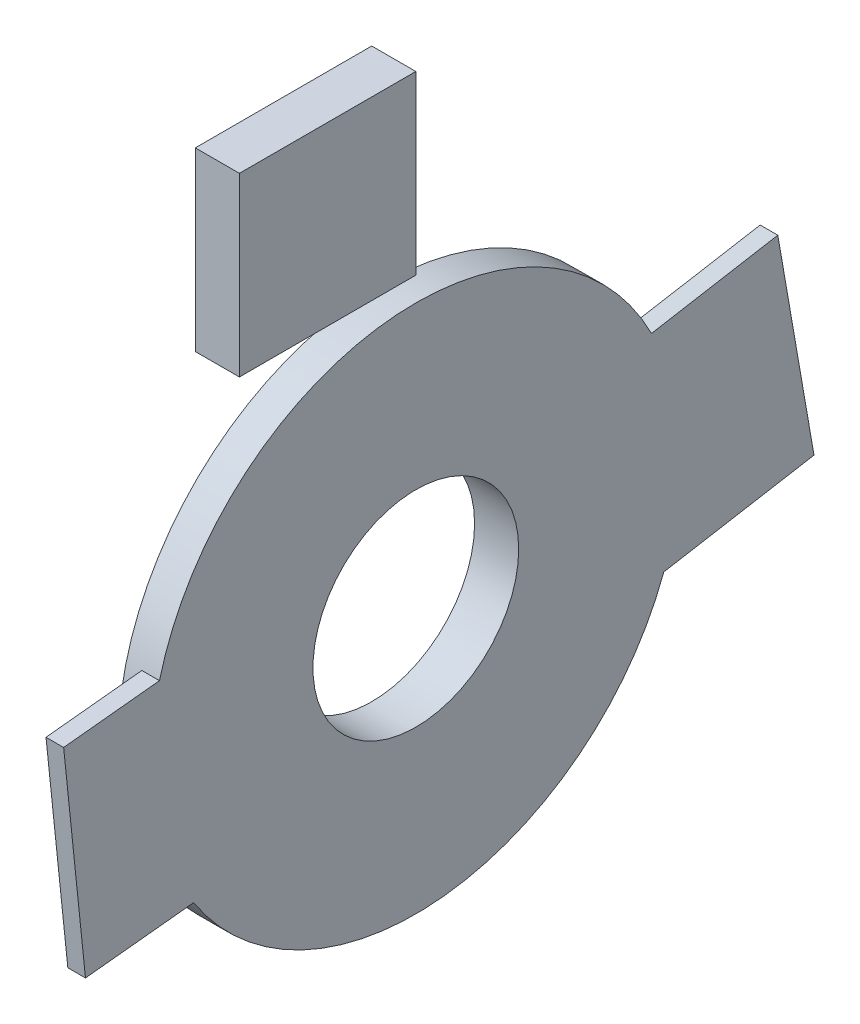
ISO-10303-21;
HEADER;
FILE_DESCRIPTION(('STEP AP214'),'2;1');
FILE_NAME('part.step','',(''),(''),'','','');
FILE_SCHEMA(('AUTOMOTIVE_DESIGN { 1 0 10303 214 1 1 1 1 }'));
ENDSEC;
DATA;
#1=APPLICATION_CONTEXT('core data for automotive mechanical design processes');
#2=APPLICATION_PROTOCOL_DEFINITION('international standard','automotive_design',2000,#1);
#3=PRODUCT_CONTEXT('',#1,'mechanical');
#4=PRODUCT('Part','Part','',(#3));
#5=PRODUCT_RELATED_PRODUCT_CATEGORY('part','',(#4));
#6=PRODUCT_DEFINITION_FORMATION('','',#4);
#7=PRODUCT_DEFINITION_CONTEXT('part definition',#1,'design');
#8=PRODUCT_DEFINITION('design','',#6,#7);
#9=PRODUCT_DEFINITION_SHAPE('','',#8);
#10=(LENGTH_UNIT() NAMED_UNIT(*) SI_UNIT(.MILLI.,.METRE.));
#11=(NAMED_UNIT(*) PLANE_ANGLE_UNIT() SI_UNIT($,.RADIAN.));
#12=(NAMED_UNIT(*) SI_UNIT($,.STERADIAN.) SOLID_ANGLE_UNIT());
#13=UNCERTAINTY_MEASURE_WITH_UNIT(LENGTH_MEASURE(1.E-05),#10,'distance_accuracy_value','');
#14=(GEOMETRIC_REPRESENTATION_CONTEXT(3) GLOBAL_UNCERTAINTY_ASSIGNED_CONTEXT((#13)) GLOBAL_UNIT_ASSIGNED_CONTEXT((#10,
#11,#12)) REPRESENTATION_CONTEXT('',''));
#15=CARTESIAN_POINT('',(0.,0.,0.));
#16=DIRECTION('',(0.,0.,1.));
#17=DIRECTION('',(1.,0.,0.));
#18=AXIS2_PLACEMENT_3D('',#15,#16,#17);
#19=CARTESIAN_POINT('',(-17.9605122421383,20.7763557032716,0.));
#20=DIRECTION('',(0.,-1.,0.));
#21=DIRECTION('',(0.,0.,-1.));
#22=AXIS2_PLACEMENT_3D('',#19,#20,#21);
#23=PLANE('',#22);
#24=DIRECTION('',(0.,0.,1.));
#25=VECTOR('',#24,1.);
#26=CARTESIAN_POINT('',(0.,20.7763557032716,0.));
#27=LINE('',#26,#25);
#28=CARTESIAN_POINT('',(0.,20.7763557032716,0.));
#29=VERTEX_POINT('',#28);
#30=CARTESIAN_POINT('',(0.,20.7763557032716,12.7));
#31=VERTEX_POINT('',#30);
#32=EDGE_CURVE('E55',#29,#31,#27,.T.);
#33=ORIENTED_EDGE('',*,*,#32,.F.);
#34=DIRECTION('',(1.,0.,0.));
#35=VECTOR('',#34,1.);
#36=CARTESIAN_POINT('',(-17.9605122421383,20.7763557032716,0.));
#37=LINE('',#36,#35);
#38=CARTESIAN_POINT('',(3.175,20.7763557032716,0.));
#39=VERTEX_POINT('',#38);
#40=EDGE_CURVE('E83',#29,#39,#37,.T.);
#41=ORIENTED_EDGE('',*,*,#40,.T.);
#42=DIRECTION('',(0.,0.,-1.));
#43=VECTOR('',#42,1.);
#44=CARTESIAN_POINT('',(3.175,20.7763557032716,0.));
#45=LINE('',#44,#43);
#46=CARTESIAN_POINT('',(3.175,20.7763557032716,12.7));
#47=VERTEX_POINT('',#46);
#48=EDGE_CURVE('E87',#47,#39,#45,.T.);
#49=ORIENTED_EDGE('',*,*,#48,.F.);
#50=DIRECTION('',(1.,0.,0.));
#51=VECTOR('',#50,1.);
#52=CARTESIAN_POINT('',(-17.9605122421383,20.7763557032716,12.7));
#53=LINE('',#52,#51);
#54=EDGE_CURVE('E110',#31,#47,#53,.T.);
#55=ORIENTED_EDGE('',*,*,#54,.F.);
#56=EDGE_LOOP('',(#33,#41,#49,#55));
#57=FACE_BOUND('',#56,.T.);
#58=ADVANCED_FACE('F47',(#57),#23,.T.);
#59=CARTESIAN_POINT('',(-17.9605122421383,20.7763557032716,12.7));
#60=DIRECTION('',(0.,0.,1.));
#61=DIRECTION('',(1.,0.,0.));
#62=AXIS2_PLACEMENT_3D('',#59,#60,#61);
#63=PLANE('',#62);
#64=DIRECTION('',(0.,1.,0.));
#65=VECTOR('',#64,1.);
#66=CARTESIAN_POINT('',(0.,20.7763557032716,12.7));
#67=LINE('',#66,#65);
#68=CARTESIAN_POINT('',(0.,33.4763557032716,12.7));
#69=VERTEX_POINT('',#68);
#70=EDGE_CURVE('E61',#31,#69,#67,.T.);
#71=ORIENTED_EDGE('',*,*,#70,.F.);
#72=ORIENTED_EDGE('',*,*,#54,.T.);
#73=DIRECTION('',(0.,-1.,0.));
#74=VECTOR('',#73,1.);
#75=CARTESIAN_POINT('',(3.175,20.7763557032716,12.7));
#76=LINE('',#75,#74);
#77=CARTESIAN_POINT('',(3.175,33.4763557032716,12.7));
#78=VERTEX_POINT('',#77);
#79=EDGE_CURVE('E92',#78,#47,#76,.T.);
#80=ORIENTED_EDGE('',*,*,#79,.F.);
#81=DIRECTION('',(1.,0.,0.));
#82=VECTOR('',#81,1.);
#83=CARTESIAN_POINT('',(-17.9605122421383,33.4763557032716,12.7));
#84=LINE('',#83,#82);
#85=EDGE_CURVE('E113',#69,#78,#84,.T.);
#86=ORIENTED_EDGE('',*,*,#85,.F.);
#87=EDGE_LOOP('',(#71,#72,#80,#86));
#88=FACE_BOUND('',#87,.T.);
#89=ADVANCED_FACE('F119',(#88),#63,.T.);
#90=CARTESIAN_POINT('',(-17.9605122421383,33.4763557032716,0.));
#91=DIRECTION('',(0.,1.,0.));
#92=DIRECTION('',(0.,0.,1.));
#93=AXIS2_PLACEMENT_3D('',#90,#91,#92);
#94=PLANE('',#93);
#95=DIRECTION('',(0.,0.,-1.));
#96=VECTOR('',#95,1.);
#97=CARTESIAN_POINT('',(0.,33.4763557032716,0.));
#98=LINE('',#97,#96);
#99=CARTESIAN_POINT('',(0.,33.4763557032716,0.));
#100=VERTEX_POINT('',#99);
#101=EDGE_CURVE('E112',#69,#100,#98,.T.);
#102=ORIENTED_EDGE('',*,*,#101,.F.);
#103=ORIENTED_EDGE('',*,*,#85,.T.);
#104=DIRECTION('',(0.,0.,1.));
#105=VECTOR('',#104,1.);
#106=CARTESIAN_POINT('',(3.175,33.4763557032716,0.));
#107=LINE('',#106,#105);
#108=CARTESIAN_POINT('',(3.175,33.4763557032716,0.));
#109=VERTEX_POINT('',#108);
#110=EDGE_CURVE('E100',#109,#78,#107,.T.);
#111=ORIENTED_EDGE('',*,*,#110,.F.);
#112=DIRECTION('',(1.,0.,0.));
#113=VECTOR('',#112,1.);
#114=CARTESIAN_POINT('',(-17.9605122421383,33.4763557032716,0.));
#115=LINE('',#114,#113);
#116=EDGE_CURVE('E91',#100,#109,#115,.T.);
#117=ORIENTED_EDGE('',*,*,#116,.F.);
#118=EDGE_LOOP('',(#102,#103,#111,#117));
#119=FACE_BOUND('',#118,.T.);
#120=ADVANCED_FACE('F117',(#119),#94,.T.);
#121=CARTESIAN_POINT('',(-17.9605122421383,20.7763557032716,0.));
#122=DIRECTION('',(0.,0.,-1.));
#123=DIRECTION('',(-1.,0.,0.));
#124=AXIS2_PLACEMENT_3D('',#121,#122,#123);
#125=PLANE('',#124);
#126=DIRECTION('',(0.,-1.,0.));
#127=VECTOR('',#126,1.);
#128=CARTESIAN_POINT('',(0.,20.7763557032716,0.));
#129=LINE('',#128,#127);
#130=EDGE_CURVE('E12',#100,#29,#129,.T.);
#131=ORIENTED_EDGE('',*,*,#130,.F.);
#132=ORIENTED_EDGE('',*,*,#116,.T.);
#133=DIRECTION('',(0.,1.,0.));
#134=VECTOR('',#133,1.);
#135=CARTESIAN_POINT('',(3.175,20.7763557032716,0.));
#136=LINE('',#135,#134);
#137=EDGE_CURVE('E94',#39,#109,#136,.T.);
#138=ORIENTED_EDGE('',*,*,#137,.F.);
#139=ORIENTED_EDGE('',*,*,#40,.F.);
#140=EDGE_LOOP('',(#131,#132,#138,#139));
#141=FACE_BOUND('',#140,.T.);
#142=ADVANCED_FACE('F95',(#141),#125,.T.);
#143=CARTESIAN_POINT('',(3.175,0.,0.));
#144=DIRECTION('',(-1.,0.,0.));
#145=DIRECTION('',(0.,0.,1.));
#146=AXIS2_PLACEMENT_3D('',#143,#144,#145);
#147=PLANE('',#146);
#148=ORIENTED_EDGE('',*,*,#48,.T.);
#149=ORIENTED_EDGE('',*,*,#137,.T.);
#150=ORIENTED_EDGE('',*,*,#110,.T.);
#151=ORIENTED_EDGE('',*,*,#79,.T.);
#152=EDGE_LOOP('',(#148,#149,#150,#151));
#153=FACE_BOUND('',#152,.T.);
#154=ADVANCED_FACE('F102',(#153),#147,.F.);
#155=CARTESIAN_POINT('',(0.,0.,0.));
#156=DIRECTION('',(1.,0.,0.));
#157=DIRECTION('',(0.,0.,-1.));
#158=AXIS2_PLACEMENT_3D('',#155,#156,#157);
#159=PLANE('',#158);
#160=ORIENTED_EDGE('',*,*,#32,.T.);
#161=ORIENTED_EDGE('',*,*,#70,.T.);
#162=ORIENTED_EDGE('',*,*,#101,.T.);
#163=ORIENTED_EDGE('',*,*,#130,.T.);
#164=EDGE_LOOP('',(#160,#161,#162,#163));
#165=FACE_BOUND('',#164,.T.);
#166=ADVANCED_FACE('F121',(#165),#159,.F.);
#167=CLOSED_SHELL('',(#58,#89,#120,#142,#154,#166));
#168=MANIFOLD_SOLID_BREP('B2',#167);
#169=CARTESIAN_POINT('',(0.,0.,0.));
#170=DIRECTION('',(1.,0.,0.));
#171=DIRECTION('',(0.,0.,-1.));
#172=AXIS2_PLACEMENT_3D('',#169,#170,#171);
#173=PLANE('',#172);
#174=CARTESIAN_POINT('',(0.,0.,0.));
#175=DIRECTION('',(1.,0.,0.));
#176=DIRECTION('',(0.,0.,-1.));
#177=AXIS2_PLACEMENT_3D('',#174,#175,#176);
#178=CIRCLE('',#177,7.40567190289533);
#179=CARTESIAN_POINT('',(0.,0.,-7.40567190289533));
#180=VERTEX_POINT('',#179);
#181=EDGE_CURVE('E309',#180,#180,#178,.T.);
#182=ORIENTED_EDGE('',*,*,#181,.T.);
#183=EDGE_LOOP('',(#182));
#184=FACE_BOUND('',#183,.T.);
#185=CARTESIAN_POINT('',(0.,0.,0.));
#186=DIRECTION('',(-1.,0.,0.));
#187=DIRECTION('',(0.,0.,1.));
#188=AXIS2_PLACEMENT_3D('',#185,#186,#187);
#189=CIRCLE('',#188,9.525);
#190=CARTESIAN_POINT('',(0.,0.,9.525));
#191=VERTEX_POINT('',#190);
#192=EDGE_CURVE('E305',#191,#191,#189,.T.);
#193=ORIENTED_EDGE('',*,*,#192,.T.);
#194=EDGE_LOOP('',(#193));
#195=FACE_BOUND('',#194,.T.);
#196=ADVANCED_FACE('F172',(#184,#195),#173,.F.);
#197=CARTESIAN_POINT('',(3.175,0.,0.));
#198=DIRECTION('',(-1.,0.,0.));
#199=DIRECTION('',(0.,0.,1.));
#200=AXIS2_PLACEMENT_3D('',#197,#198,#199);
#201=CYLINDRICAL_SURFACE('',#200,19.05);
#202=CARTESIAN_POINT('',(1.905,0.,0.));
#203=DIRECTION('',(1.,0.,0.));
#204=DIRECTION('',(0.,0.,-1.));
#205=AXIS2_PLACEMENT_3D('',#202,#203,#204);
#206=CIRCLE('',#205,19.05);
#207=CARTESIAN_POINT('',(1.905,4.72453771983836,18.4548433570655));
#208=VERTEX_POINT('',#207);
#209=CARTESIAN_POINT('',(1.905,-10.3424247438689,15.998023328443));
#210=VERTEX_POINT('',#209);
#211=EDGE_CURVE('E45',#208,#210,#206,.T.);
#212=ORIENTED_EDGE('',*,*,#211,.F.);
#213=DIRECTION('',(-1.,0.,0.));
#214=VECTOR('',#213,1.);
#215=CARTESIAN_POINT('',(3.175,4.72453771983836,18.4548433570655));
#216=LINE('',#215,#214);
#217=CARTESIAN_POINT('',(3.175,4.72453771983836,18.4548433570655));
#218=VERTEX_POINT('',#217);
#219=EDGE_CURVE('E244',#208,#218,#216,.F.);
#220=ORIENTED_EDGE('',*,*,#219,.T.);
#221=CARTESIAN_POINT('',(3.175,0.,0.));
#222=DIRECTION('',(1.,0.,0.));
#223=DIRECTION('',(0.,0.,-1.));
#224=AXIS2_PLACEMENT_3D('',#221,#222,#223);
#225=CIRCLE('',#224,19.05);
#226=CARTESIAN_POINT('',(3.175,8.66374116255442,-16.9659096151153));
#227=VERTEX_POINT('',#226);
#228=EDGE_CURVE('E316',#227,#218,#225,.T.);
#229=ORIENTED_EDGE('',*,*,#228,.F.);
#230=DIRECTION('',(-1.,0.,0.));
#231=VECTOR('',#230,1.);
#232=CARTESIAN_POINT('',(3.175,8.66374116255442,-16.9659096151153));
#233=LINE('',#232,#231);
#234=CARTESIAN_POINT('',(1.905,8.66374116255442,-16.9659096151153));
#235=VERTEX_POINT('',#234);
#236=EDGE_CURVE('E293',#227,#235,#233,.T.);
#237=ORIENTED_EDGE('',*,*,#236,.T.);
#238=CARTESIAN_POINT('',(1.905,0.,0.));
#239=DIRECTION('',(-1.,0.,0.));
#240=DIRECTION('',(0.,0.,1.));
#241=AXIS2_PLACEMENT_3D('',#238,#239,#240);
#242=CIRCLE('',#241,19.05);
#243=CARTESIAN_POINT('',(1.905,-6.6502263441563,-17.8515262532784));
#244=VERTEX_POINT('',#243);
#245=EDGE_CURVE('E180',#235,#244,#242,.T.);
#246=ORIENTED_EDGE('',*,*,#245,.T.);
#247=DIRECTION('',(-1.,0.,0.));
#248=VECTOR('',#247,1.);
#249=CARTESIAN_POINT('',(3.175,-6.6502263441563,-17.8515262532784));
#250=LINE('',#249,#248);
#251=CARTESIAN_POINT('',(3.175,-6.65022634415631,-17.8515262532784));
#252=VERTEX_POINT('',#251);
#253=EDGE_CURVE('E288',#244,#252,#250,.F.);
#254=ORIENTED_EDGE('',*,*,#253,.T.);
#255=CARTESIAN_POINT('',(3.175,-10.3424247438689,15.998023328443));
#256=VERTEX_POINT('',#255);
#257=EDGE_CURVE('E312',#256,#252,#225,.T.);
#258=ORIENTED_EDGE('',*,*,#257,.F.);
#259=DIRECTION('',(-1.,0.,0.));
#260=VECTOR('',#259,1.);
#261=CARTESIAN_POINT('',(3.175,-10.3424247438689,15.998023328443));
#262=LINE('',#261,#260);
#263=EDGE_CURVE('E267',#256,#210,#262,.T.);
#264=ORIENTED_EDGE('',*,*,#263,.T.);
#265=EDGE_LOOP('',(#212,#220,#229,#237,#246,#254,#258,#264));
#266=FACE_BOUND('',#265,.T.);
#267=CARTESIAN_POINT('',(0.7874,0.,0.));
#268=DIRECTION('',(-1.,0.,0.));
#269=DIRECTION('',(0.,0.,1.));
#270=AXIS2_PLACEMENT_3D('',#267,#268,#269);
#271=CIRCLE('',#270,19.05);
#272=CARTESIAN_POINT('',(0.7874,0.,19.05));
#273=VERTEX_POINT('',#272);
#274=EDGE_CURVE('E296',#273,#273,#271,.T.);
#275=ORIENTED_EDGE('',*,*,#274,.F.);
#276=EDGE_LOOP('',(#275));
#277=FACE_BOUND('',#276,.T.);
#278=ADVANCED_FACE('F174',(#266,#277),#201,.T.);
#279=CARTESIAN_POINT('',(3.175,0.,0.));
#280=DIRECTION('',(1.,0.,0.));
#281=DIRECTION('',(0.,0.,-1.));
#282=AXIS2_PLACEMENT_3D('',#279,#280,#281);
#283=PLANE('',#282);
#284=ORIENTED_EDGE('',*,*,#228,.T.);
#285=DIRECTION('',(0.,-0.103134975209208,0.994667369972795));
#286=VECTOR('',#285,1.);
#287=CARTESIAN_POINT('',(3.175,5.09174480926587,14.9133783095845));
#288=LINE('',#287,#286);
#289=CARTESIAN_POINT('',(3.175,4.00930276164016,25.352802786837));
#290=VERTEX_POINT('',#289);
#291=EDGE_CURVE('E263',#218,#290,#288,.T.);
#292=ORIENTED_EDGE('',*,*,#291,.T.);
#293=DIRECTION('',(0.,-0.994667369972795,-0.103134975209207));
#294=VECTOR('',#293,1.);
#295=CARTESIAN_POINT('',(3.175,4.00930276164016,25.352802786837));
#296=LINE('',#295,#294);
#297=CARTESIAN_POINT('',(3.175,-11.1494279567452,23.7810257646487));
#298=VERTEX_POINT('',#297);
#299=EDGE_CURVE('E253',#290,#298,#296,.T.);
#300=ORIENTED_EDGE('',*,*,#299,.T.);
#301=DIRECTION('',(0.,0.103134975209207,-0.994667369972795));
#302=VECTOR('',#301,1.);
#303=CARTESIAN_POINT('',(3.175,-10.0669859091195,13.3416012873962));
#304=LINE('',#303,#302);
#305=EDGE_CURVE('E187',#298,#256,#304,.T.);
#306=ORIENTED_EDGE('',*,*,#305,.T.);
#307=ORIENTED_EDGE('',*,*,#257,.T.);
#308=DIRECTION('',(0.,0.170914742921336,-0.985285821806106));
#309=VECTOR('',#308,1.);
#310=CARTESIAN_POINT('',(3.175,-7.10880283141893,-15.2079338785617));
#311=LINE('',#310,#309);
#312=CARTESIAN_POINT('',(3.175,-4.77477055550584,-28.663115507647));
#313=VERTEX_POINT('',#312);
#314=EDGE_CURVE('E283',#252,#313,#311,.T.);
#315=ORIENTED_EDGE('',*,*,#314,.T.);
#316=DIRECTION('',(0.,0.985285821806106,0.170914742921336));
#317=VECTOR('',#316,1.);
#318=CARTESIAN_POINT('',(3.175,10.2409853688192,-26.0583748255259));
#319=LINE('',#318,#317);
#320=CARTESIAN_POINT('',(3.175,10.2409853688192,-26.0583748255259));
#321=VERTEX_POINT('',#320);
#322=EDGE_CURVE('E276',#313,#321,#319,.T.);
#323=ORIENTED_EDGE('',*,*,#322,.T.);
#324=DIRECTION('',(0.,-0.170914742921336,0.985285821806106));
#325=VECTOR('',#324,1.);
#326=CARTESIAN_POINT('',(3.175,7.90695309290612,-12.6031931964405));
#327=LINE('',#326,#325);
#328=EDGE_CURVE('E194',#321,#227,#327,.T.);
#329=ORIENTED_EDGE('',*,*,#328,.T.);
#330=EDGE_LOOP('',(#284,#292,#300,#306,#307,#315,#323,#329));
#331=FACE_BOUND('',#330,.T.);
#332=CARTESIAN_POINT('',(3.175,0.,0.));
#333=DIRECTION('',(1.,0.,0.));
#334=DIRECTION('',(0.,0.,-1.));
#335=AXIS2_PLACEMENT_3D('',#332,#333,#334);
#336=CIRCLE('',#335,7.40567190289533);
#337=CARTESIAN_POINT('',(3.175,0.,-7.40567190289533));
#338=VERTEX_POINT('',#337);
#339=EDGE_CURVE('E310',#338,#338,#336,.T.);
#340=ORIENTED_EDGE('',*,*,#339,.F.);
#341=EDGE_LOOP('',(#340));
#342=FACE_BOUND('',#341,.T.);
#343=ADVANCED_FACE('F336',(#331,#342),#283,.T.);
#344=CARTESIAN_POINT('',(3.175,0.,0.));
#345=DIRECTION('',(-1.,0.,0.));
#346=DIRECTION('',(0.,0.,1.));
#347=AXIS2_PLACEMENT_3D('',#344,#345,#346);
#348=CYLINDRICAL_SURFACE('',#347,7.40567190289533);
#349=ORIENTED_EDGE('',*,*,#339,.T.);
#350=EDGE_LOOP('',(#349));
#351=FACE_BOUND('',#350,.T.);
#352=ORIENTED_EDGE('',*,*,#181,.F.);
#353=EDGE_LOOP('',(#352));
#354=FACE_BOUND('',#353,.T.);
#355=ADVANCED_FACE('F358',(#351,#354),#348,.F.);
#356=CARTESIAN_POINT('',(0.,0.,0.));
#357=DIRECTION('',(-1.,0.,0.));
#358=DIRECTION('',(0.,0.,1.));
#359=AXIS2_PLACEMENT_3D('',#356,#357,#358);
#360=CYLINDRICAL_SURFACE('',#359,9.525);
#361=CARTESIAN_POINT('',(0.787400000000001,0.,0.));
#362=DIRECTION('',(-1.,0.,0.));
#363=DIRECTION('',(0.,0.,1.));
#364=AXIS2_PLACEMENT_3D('',#361,#362,#363);
#365=CIRCLE('',#364,9.525);
#366=CARTESIAN_POINT('',(0.787400000000001,0.,9.525));
#367=VERTEX_POINT('',#366);
#368=EDGE_CURVE('E299',#367,#367,#365,.T.);
#369=ORIENTED_EDGE('',*,*,#368,.T.);
#370=EDGE_LOOP('',(#369));
#371=FACE_BOUND('',#370,.T.);
#372=ORIENTED_EDGE('',*,*,#192,.F.);
#373=EDGE_LOOP('',(#372));
#374=FACE_BOUND('',#373,.T.);
#375=ADVANCED_FACE('F361',(#371,#374),#360,.T.);
#376=CARTESIAN_POINT('',(0.787400000000001,19.05,0.));
#377=DIRECTION('',(-1.,0.,0.));
#378=DIRECTION('',(0.,0.,1.));
#379=AXIS2_PLACEMENT_3D('',#376,#377,#378);
#380=PLANE('',#379);
#381=ORIENTED_EDGE('',*,*,#274,.T.);
#382=EDGE_LOOP('',(#381));
#383=FACE_BOUND('',#382,.T.);
#384=ORIENTED_EDGE('',*,*,#368,.F.);
#385=EDGE_LOOP('',(#384));
#386=FACE_BOUND('',#385,.T.);
#387=ADVANCED_FACE('F365',(#383,#386),#380,.T.);
#388=CARTESIAN_POINT('',(1.905,7.90695309290612,-12.6031931964405));
#389=DIRECTION('',(0.,0.985285821806106,0.170914742921336));
#390=DIRECTION('',(0.,-0.170914742921336,0.985285821806106));
#391=AXIS2_PLACEMENT_3D('',#388,#389,#390);
#392=PLANE('',#391);
#393=ORIENTED_EDGE('',*,*,#236,.F.);
#394=ORIENTED_EDGE('',*,*,#328,.F.);
#395=DIRECTION('',(1.,0.,0.));
#396=VECTOR('',#395,1.);
#397=CARTESIAN_POINT('',(1.905,10.2409853688192,-26.0583748255259));
#398=LINE('',#397,#396);
#399=CARTESIAN_POINT('',(1.905,10.2409853688192,-26.0583748255259));
#400=VERTEX_POINT('',#399);
#401=EDGE_CURVE('E286',#400,#321,#398,.T.);
#402=ORIENTED_EDGE('',*,*,#401,.F.);
#403=DIRECTION('',(0.,-0.170914742921336,0.985285821806106));
#404=VECTOR('',#403,1.);
#405=CARTESIAN_POINT('',(1.905,7.90695309290612,-12.6031931964405));
#406=LINE('',#405,#404);
#407=EDGE_CURVE('E272',#400,#235,#406,.T.);
#408=ORIENTED_EDGE('',*,*,#407,.T.);
#409=EDGE_LOOP('',(#393,#394,#402,#408));
#410=FACE_BOUND('',#409,.T.);
#411=ADVANCED_FACE('F328',(#410),#392,.T.);
#412=CARTESIAN_POINT('',(1.905,-7.10880283141893,-15.2079338785617));
#413=DIRECTION('',(0.,-0.985285821806106,-0.170914742921336));
#414=DIRECTION('',(0.,0.170914742921336,-0.985285821806106));
#415=AXIS2_PLACEMENT_3D('',#412,#413,#414);
#416=PLANE('',#415);
#417=ORIENTED_EDGE('',*,*,#253,.F.);
#418=DIRECTION('',(0.,0.170914742921336,-0.985285821806106));
#419=VECTOR('',#418,1.);
#420=CARTESIAN_POINT('',(1.905,-7.10880283141893,-15.2079338785617));
#421=LINE('',#420,#419);
#422=CARTESIAN_POINT('',(1.905,-4.77477055550584,-28.663115507647));
#423=VERTEX_POINT('',#422);
#424=EDGE_CURVE('E275',#244,#423,#421,.T.);
#425=ORIENTED_EDGE('',*,*,#424,.T.);
#426=DIRECTION('',(1.,0.,0.));
#427=VECTOR('',#426,1.);
#428=CARTESIAN_POINT('',(1.905,-4.77477055550584,-28.663115507647));
#429=LINE('',#428,#427);
#430=EDGE_CURVE('E281',#423,#313,#429,.T.);
#431=ORIENTED_EDGE('',*,*,#430,.T.);
#432=ORIENTED_EDGE('',*,*,#314,.F.);
#433=EDGE_LOOP('',(#417,#425,#431,#432));
#434=FACE_BOUND('',#433,.T.);
#435=ADVANCED_FACE('F335',(#434),#416,.T.);
#436=CARTESIAN_POINT('',(1.905,10.2409853688192,-26.0583748255259));
#437=DIRECTION('',(0.,0.170914742921336,-0.985285821806106));
#438=DIRECTION('',(0.,0.985285821806106,0.170914742921336));
#439=AXIS2_PLACEMENT_3D('',#436,#437,#438);
#440=PLANE('',#439);
#441=ORIENTED_EDGE('',*,*,#322,.F.);
#442=ORIENTED_EDGE('',*,*,#430,.F.);
#443=DIRECTION('',(0.,0.985285821806106,0.170914742921336));
#444=VECTOR('',#443,1.);
#445=CARTESIAN_POINT('',(1.905,10.2409853688192,-26.0583748255259));
#446=LINE('',#445,#444);
#447=EDGE_CURVE('E278',#423,#400,#446,.T.);
#448=ORIENTED_EDGE('',*,*,#447,.T.);
#449=ORIENTED_EDGE('',*,*,#401,.T.);
#450=EDGE_LOOP('',(#441,#442,#448,#449));
#451=FACE_BOUND('',#450,.T.);
#452=ADVANCED_FACE('F331',(#451),#440,.T.);
#453=CARTESIAN_POINT('',(1.905,0.,0.));
#454=DIRECTION('',(-1.,0.,0.));
#455=DIRECTION('',(0.,0.,1.));
#456=AXIS2_PLACEMENT_3D('',#453,#454,#455);
#457=PLANE('',#456);
#458=ORIENTED_EDGE('',*,*,#245,.F.);
#459=ORIENTED_EDGE('',*,*,#407,.F.);
#460=ORIENTED_EDGE('',*,*,#447,.F.);
#461=ORIENTED_EDGE('',*,*,#424,.F.);
#462=EDGE_LOOP('',(#458,#459,#460,#461));
#463=FACE_BOUND('',#462,.T.);
#464=ADVANCED_FACE('F325',(#463),#457,.T.);
#465=CARTESIAN_POINT('',(1.905,5.09174480926587,14.9133783095845));
#466=DIRECTION('',(0.,0.994667369972794,0.103134975209208));
#467=DIRECTION('',(0.,-0.103134975209208,0.994667369972795));
#468=AXIS2_PLACEMENT_3D('',#465,#466,#467);
#469=PLANE('',#468);
#470=ORIENTED_EDGE('',*,*,#219,.F.);
#471=DIRECTION('',(0.,-0.103134975209208,0.994667369972795));
#472=VECTOR('',#471,1.);
#473=CARTESIAN_POINT('',(1.905,5.09174480926587,14.9133783095845));
#474=LINE('',#473,#472);
#475=CARTESIAN_POINT('',(1.905,4.00930276164016,25.352802786837));
#476=VERTEX_POINT('',#475);
#477=EDGE_CURVE('E238',#208,#476,#474,.T.);
#478=ORIENTED_EDGE('',*,*,#477,.T.);
#479=DIRECTION('',(1.,0.,0.));
#480=VECTOR('',#479,1.);
#481=CARTESIAN_POINT('',(1.905,4.00930276164016,25.352802786837));
#482=LINE('',#481,#480);
#483=EDGE_CURVE('E241',#476,#290,#482,.T.);
#484=ORIENTED_EDGE('',*,*,#483,.T.);
#485=ORIENTED_EDGE('',*,*,#291,.F.);
#486=EDGE_LOOP('',(#470,#478,#484,#485));
#487=FACE_BOUND('',#486,.T.);
#488=ADVANCED_FACE('F240',(#487),#469,.T.);
#489=CARTESIAN_POINT('',(1.905,-10.0669859091195,13.3416012873962));
#490=DIRECTION('',(0.,-0.994667369972794,-0.103134975209207));
#491=DIRECTION('',(0.,0.103134975209207,-0.994667369972795));
#492=AXIS2_PLACEMENT_3D('',#489,#490,#491);
#493=PLANE('',#492);
#494=ORIENTED_EDGE('',*,*,#263,.F.);
#495=ORIENTED_EDGE('',*,*,#305,.F.);
#496=DIRECTION('',(1.,0.,0.));
#497=VECTOR('',#496,1.);
#498=CARTESIAN_POINT('',(1.905,-11.1494279567452,23.7810257646487));
#499=LINE('',#498,#497);
#500=CARTESIAN_POINT('',(1.905,-11.1494279567452,23.7810257646487));
#501=VERTEX_POINT('',#500);
#502=EDGE_CURVE('E254',#501,#298,#499,.T.);
#503=ORIENTED_EDGE('',*,*,#502,.F.);
#504=DIRECTION('',(0.,0.103134975209207,-0.994667369972795));
#505=VECTOR('',#504,1.);
#506=CARTESIAN_POINT('',(1.905,-10.0669859091195,13.3416012873962));
#507=LINE('',#506,#505);
#508=EDGE_CURVE('E255',#501,#210,#507,.T.);
#509=ORIENTED_EDGE('',*,*,#508,.T.);
#510=EDGE_LOOP('',(#494,#495,#503,#509));
#511=FACE_BOUND('',#510,.T.);
#512=ADVANCED_FACE('F339',(#511),#493,.T.);
#513=CARTESIAN_POINT('',(1.905,4.00930276164016,25.352802786837));
#514=DIRECTION('',(0.,-0.103134975209207,0.994667369972794));
#515=DIRECTION('',(0.,-0.994667369972795,-0.103134975209207));
#516=AXIS2_PLACEMENT_3D('',#513,#514,#515);
#517=PLANE('',#516);
#518=ORIENTED_EDGE('',*,*,#299,.F.);
#519=ORIENTED_EDGE('',*,*,#483,.F.);
#520=DIRECTION('',(0.,-0.994667369972795,-0.103134975209207));
#521=VECTOR('',#520,1.);
#522=CARTESIAN_POINT('',(1.905,4.00930276164016,25.352802786837));
#523=LINE('',#522,#521);
#524=EDGE_CURVE('E248',#476,#501,#523,.T.);
#525=ORIENTED_EDGE('',*,*,#524,.T.);
#526=ORIENTED_EDGE('',*,*,#502,.T.);
#527=EDGE_LOOP('',(#518,#519,#525,#526));
#528=FACE_BOUND('',#527,.T.);
#529=ADVANCED_FACE('F252',(#528),#517,.T.);
#530=CARTESIAN_POINT('',(1.905,0.,0.));
#531=DIRECTION('',(1.,0.,0.));
#532=DIRECTION('',(0.,0.,-1.));
#533=AXIS2_PLACEMENT_3D('',#530,#531,#532);
#534=PLANE('',#533);
#535=ORIENTED_EDGE('',*,*,#477,.F.);
#536=ORIENTED_EDGE('',*,*,#211,.T.);
#537=ORIENTED_EDGE('',*,*,#508,.F.);
#538=ORIENTED_EDGE('',*,*,#524,.F.);
#539=EDGE_LOOP('',(#535,#536,#537,#538));
#540=FACE_BOUND('',#539,.T.);
#541=ADVANCED_FACE('F258',(#540),#534,.F.);
#542=CLOSED_SHELL('',(#196,#278,#343,#355,#375,#387,#411,#435,#452,#464,#488,#512,#529,#541));
#543=MANIFOLD_SOLID_BREP('B6',#542);
#544=ADVANCED_BREP_SHAPE_REPRESENTATION('',(#18,#168,#543),#14);
#545=SHAPE_DEFINITION_REPRESENTATION(#9,#544);
ENDSEC;
END-ISO-10303-21;
